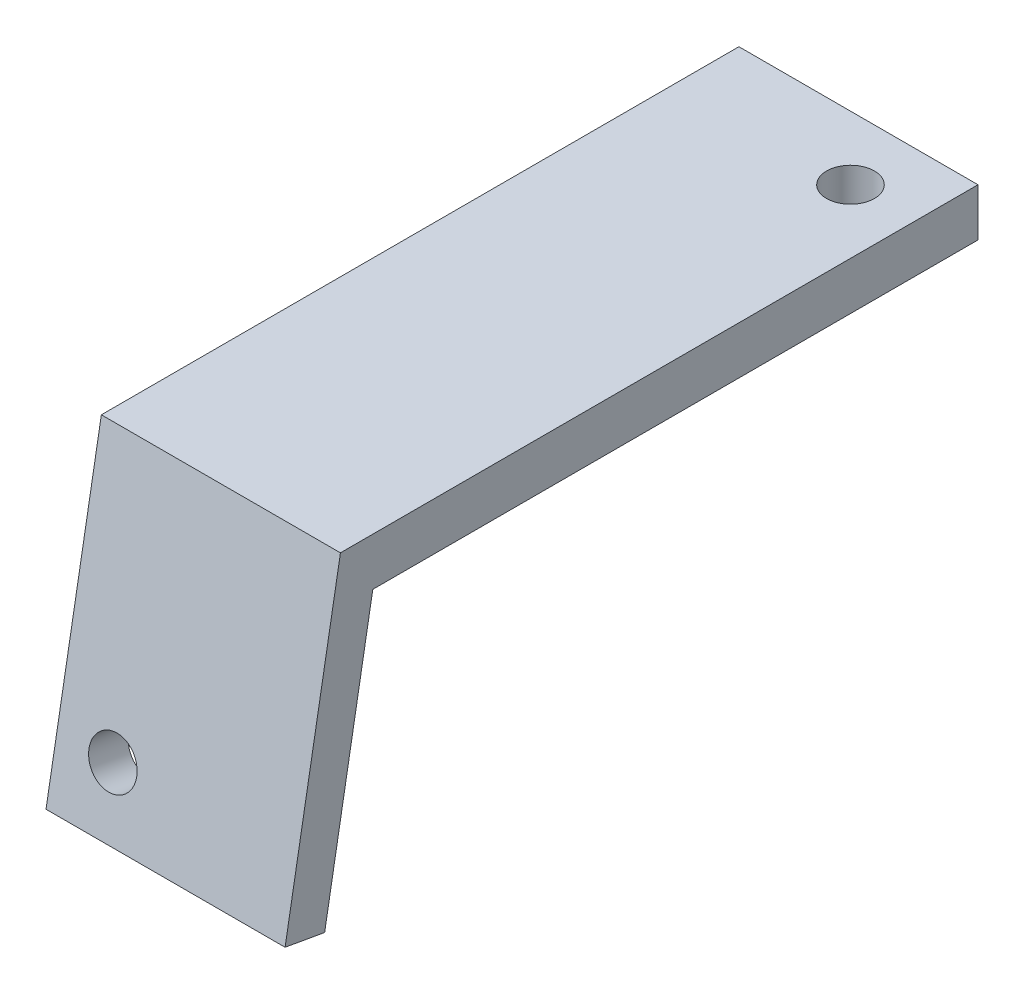
ISO-10303-21;
HEADER;
FILE_DESCRIPTION(('STEP AP214'),'2;1');
FILE_NAME('part.step','',(''),(''),'','','');
FILE_SCHEMA(('AUTOMOTIVE_DESIGN { 1 0 10303 214 1 1 1 1 }'));
ENDSEC;
DATA;
#1=APPLICATION_CONTEXT('core data for automotive mechanical design processes');
#2=APPLICATION_PROTOCOL_DEFINITION('international standard','automotive_design',2000,#1);
#3=PRODUCT_CONTEXT('',#1,'mechanical');
#4=PRODUCT('Part','Part','',(#3));
#5=PRODUCT_RELATED_PRODUCT_CATEGORY('part','',(#4));
#6=PRODUCT_DEFINITION_FORMATION('','',#4);
#7=PRODUCT_DEFINITION_CONTEXT('part definition',#1,'design');
#8=PRODUCT_DEFINITION('design','',#6,#7);
#9=PRODUCT_DEFINITION_SHAPE('','',#8);
#10=(LENGTH_UNIT() NAMED_UNIT(*) SI_UNIT(.MILLI.,.METRE.));
#11=(NAMED_UNIT(*) PLANE_ANGLE_UNIT() SI_UNIT($,.RADIAN.));
#12=(NAMED_UNIT(*) SI_UNIT($,.STERADIAN.) SOLID_ANGLE_UNIT());
#13=UNCERTAINTY_MEASURE_WITH_UNIT(LENGTH_MEASURE(1.E-05),#10,'distance_accuracy_value','');
#14=(GEOMETRIC_REPRESENTATION_CONTEXT(3) GLOBAL_UNCERTAINTY_ASSIGNED_CONTEXT((#13)) GLOBAL_UNIT_ASSIGNED_CONTEXT((#10,
#11,#12)) REPRESENTATION_CONTEXT('',''));
#15=CARTESIAN_POINT('',(0.,0.,0.));
#16=DIRECTION('',(0.,0.,1.));
#17=DIRECTION('',(1.,0.,0.));
#18=AXIS2_PLACEMENT_3D('',#15,#16,#17);
#19=CARTESIAN_POINT('',(0.,3.,0.));
#20=DIRECTION('',(0.,-1.,0.));
#21=DIRECTION('',(0.,0.,-1.));
#22=AXIS2_PLACEMENT_3D('',#19,#20,#21);
#23=PLANE('',#22);
#24=DIRECTION('',(0.,0.,-1.));
#25=VECTOR('',#24,1.);
#26=CARTESIAN_POINT('',(7.5,3.,20.));
#27=LINE('',#26,#25);
#28=CARTESIAN_POINT('',(7.5,3.,20.));
#29=VERTEX_POINT('',#28);
#30=CARTESIAN_POINT('',(7.5,3.,-20.));
#31=VERTEX_POINT('',#30);
#32=EDGE_CURVE('E97',#29,#31,#27,.T.);
#33=ORIENTED_EDGE('',*,*,#32,.T.);
#34=DIRECTION('',(-1.,0.,0.));
#35=VECTOR('',#34,1.);
#36=CARTESIAN_POINT('',(-7.5,3.,-20.));
#37=LINE('',#36,#35);
#38=CARTESIAN_POINT('',(-7.5,3.,-20.));
#39=VERTEX_POINT('',#38);
#40=EDGE_CURVE('E89',#31,#39,#37,.T.);
#41=ORIENTED_EDGE('',*,*,#40,.T.);
#42=DIRECTION('',(0.,0.,1.));
#43=VECTOR('',#42,1.);
#44=CARTESIAN_POINT('',(-7.5,3.,20.));
#45=LINE('',#44,#43);
#46=CARTESIAN_POINT('',(-7.5,3.,20.));
#47=VERTEX_POINT('',#46);
#48=EDGE_CURVE('E96',#39,#47,#45,.T.);
#49=ORIENTED_EDGE('',*,*,#48,.T.);
#50=DIRECTION('',(1.,0.,0.));
#51=VECTOR('',#50,1.);
#52=CARTESIAN_POINT('',(-7.5,3.,20.));
#53=LINE('',#52,#51);
#54=EDGE_CURVE('E101',#47,#29,#53,.T.);
#55=ORIENTED_EDGE('',*,*,#54,.T.);
#56=EDGE_LOOP('',(#33,#41,#49,#55));
#57=FACE_BOUND('',#56,.T.);
#58=CARTESIAN_POINT('',(3.5,3.,-16.));
#59=DIRECTION('',(0.,1.,0.));
#60=DIRECTION('',(0.,0.,1.));
#61=AXIS2_PLACEMENT_3D('',#58,#59,#60);
#62=CIRCLE('',#61,1.5);
#63=CARTESIAN_POINT('',(3.5,3.,-14.5));
#64=VERTEX_POINT('',#63);
#65=EDGE_CURVE('E141',#64,#64,#62,.T.);
#66=ORIENTED_EDGE('',*,*,#65,.F.);
#67=EDGE_LOOP('',(#66));
#68=FACE_BOUND('',#67,.T.);
#69=ADVANCED_FACE('F41',(#57,#68),#23,.F.);
#70=CARTESIAN_POINT('',(0.,0.,0.));
#71=DIRECTION('',(0.,-1.,0.));
#72=DIRECTION('',(0.,0.,-1.));
#73=AXIS2_PLACEMENT_3D('',#70,#71,#72);
#74=PLANE('',#73);
#75=DIRECTION('',(1.,0.,0.));
#76=VECTOR('',#75,1.);
#77=CARTESIAN_POINT('',(0.,0.,17.9691467762285));
#78=LINE('',#77,#76);
#79=CARTESIAN_POINT('',(-7.5,0.,17.9691467762285));
#80=VERTEX_POINT('',#79);
#81=CARTESIAN_POINT('',(7.5,0.,17.9691467762285));
#82=VERTEX_POINT('',#81);
#83=EDGE_CURVE('E147',#80,#82,#78,.T.);
#84=ORIENTED_EDGE('',*,*,#83,.F.);
#85=DIRECTION('',(0.,0.,1.));
#86=VECTOR('',#85,1.);
#87=CARTESIAN_POINT('',(-7.5,0.,20.));
#88=LINE('',#87,#86);
#89=CARTESIAN_POINT('',(-7.5,0.,-20.));
#90=VERTEX_POINT('',#89);
#91=EDGE_CURVE('E102',#90,#80,#88,.T.);
#92=ORIENTED_EDGE('',*,*,#91,.F.);
#93=DIRECTION('',(-1.,0.,0.));
#94=VECTOR('',#93,1.);
#95=CARTESIAN_POINT('',(-7.5,0.,-20.));
#96=LINE('',#95,#94);
#97=CARTESIAN_POINT('',(7.5,0.,-20.));
#98=VERTEX_POINT('',#97);
#99=EDGE_CURVE('E135',#98,#90,#96,.T.);
#100=ORIENTED_EDGE('',*,*,#99,.F.);
#101=DIRECTION('',(0.,0.,-1.));
#102=VECTOR('',#101,1.);
#103=CARTESIAN_POINT('',(7.5,0.,20.));
#104=LINE('',#103,#102);
#105=EDGE_CURVE('E71',#82,#98,#104,.T.);
#106=ORIENTED_EDGE('',*,*,#105,.F.);
#107=EDGE_LOOP('',(#84,#92,#100,#106));
#108=FACE_BOUND('',#107,.T.);
#109=CARTESIAN_POINT('',(3.5,0.,-16.));
#110=DIRECTION('',(0.,1.,0.));
#111=DIRECTION('',(0.,0.,1.));
#112=AXIS2_PLACEMENT_3D('',#109,#110,#111);
#113=CIRCLE('',#112,1.5);
#114=CARTESIAN_POINT('',(3.5,0.,-14.5));
#115=VERTEX_POINT('',#114);
#116=EDGE_CURVE('E143',#115,#115,#113,.T.);
#117=ORIENTED_EDGE('',*,*,#116,.T.);
#118=EDGE_LOOP('',(#117));
#119=FACE_BOUND('',#118,.T.);
#120=ADVANCED_FACE('F108',(#108,#119),#74,.T.);
#121=CARTESIAN_POINT('',(7.5,3.,20.));
#122=DIRECTION('',(-1.,0.,0.));
#123=DIRECTION('',(0.,0.,1.));
#124=AXIS2_PLACEMENT_3D('',#121,#122,#123);
#125=PLANE('',#124);
#126=DIRECTION('',(0.,0.984807753012207,-0.173648177666934));
#127=VECTOR('',#126,1.);
#128=CARTESIAN_POINT('',(7.5,-17.1339124843992,20.9903178323258));
#129=LINE('',#128,#127);
#130=CARTESIAN_POINT('',(7.5,-17.1339124843992,20.9903178323258));
#131=VERTEX_POINT('',#130);
#132=EDGE_CURVE('E106',#131,#82,#129,.T.);
#133=ORIENTED_EDGE('',*,*,#132,.T.);
#134=ORIENTED_EDGE('',*,*,#105,.T.);
#135=DIRECTION('',(0.,-1.,0.));
#136=VECTOR('',#135,1.);
#137=CARTESIAN_POINT('',(7.5,3.,-20.));
#138=LINE('',#137,#136);
#139=EDGE_CURVE('E11',#31,#98,#138,.T.);
#140=ORIENTED_EDGE('',*,*,#139,.F.);
#141=ORIENTED_EDGE('',*,*,#32,.F.);
#142=DIRECTION('',(0.,0.984807753012207,-0.173648177666934));
#143=VECTOR('',#142,1.);
#144=CARTESIAN_POINT('',(7.5,-16.6961550602442,23.4729635533387));
#145=LINE('',#144,#143);
#146=CARTESIAN_POINT('',(7.5,-16.6961550602442,23.4729635533387));
#147=VERTEX_POINT('',#146);
#148=EDGE_CURVE('E58',#147,#29,#145,.T.);
#149=ORIENTED_EDGE('',*,*,#148,.F.);
#150=DIRECTION('',(0.,-0.173648177666934,-0.984807753012207));
#151=VECTOR('',#150,1.);
#152=CARTESIAN_POINT('',(7.5,-17.1339124843992,20.9903178323258));
#153=LINE('',#152,#151);
#154=EDGE_CURVE('E159',#147,#131,#153,.T.);
#155=ORIENTED_EDGE('',*,*,#154,.T.);
#156=EDGE_LOOP('',(#133,#134,#140,#141,#149,#155));
#157=FACE_BOUND('',#156,.T.);
#158=ADVANCED_FACE('F43',(#157),#125,.F.);
#159=CARTESIAN_POINT('',(-7.5,3.,-20.));
#160=DIRECTION('',(0.,0.,1.));
#161=DIRECTION('',(1.,0.,0.));
#162=AXIS2_PLACEMENT_3D('',#159,#160,#161);
#163=PLANE('',#162);
#164=ORIENTED_EDGE('',*,*,#99,.T.);
#165=DIRECTION('',(0.,-1.,0.));
#166=VECTOR('',#165,1.);
#167=CARTESIAN_POINT('',(-7.5,3.,-20.));
#168=LINE('',#167,#166);
#169=EDGE_CURVE('E50',#39,#90,#168,.T.);
#170=ORIENTED_EDGE('',*,*,#169,.F.);
#171=ORIENTED_EDGE('',*,*,#40,.F.);
#172=ORIENTED_EDGE('',*,*,#139,.T.);
#173=EDGE_LOOP('',(#164,#170,#171,#172));
#174=FACE_BOUND('',#173,.T.);
#175=ADVANCED_FACE('F91',(#174),#163,.F.);
#176=CARTESIAN_POINT('',(-7.5,3.,20.));
#177=DIRECTION('',(1.,0.,0.));
#178=DIRECTION('',(0.,0.,-1.));
#179=AXIS2_PLACEMENT_3D('',#176,#177,#178);
#180=PLANE('',#179);
#181=ORIENTED_EDGE('',*,*,#91,.T.);
#182=DIRECTION('',(0.,0.984807753012207,-0.173648177666934));
#183=VECTOR('',#182,1.);
#184=CARTESIAN_POINT('',(-7.5,-17.1339124843992,20.9903178323258));
#185=LINE('',#184,#183);
#186=CARTESIAN_POINT('',(-7.5,-17.1339124843992,20.9903178323258));
#187=VERTEX_POINT('',#186);
#188=EDGE_CURVE('E81',#187,#80,#185,.T.);
#189=ORIENTED_EDGE('',*,*,#188,.F.);
#190=DIRECTION('',(0.,0.173648177666934,0.984807753012207));
#191=VECTOR('',#190,1.);
#192=CARTESIAN_POINT('',(-7.5,-17.1339124843992,20.9903178323258));
#193=LINE('',#192,#191);
#194=CARTESIAN_POINT('',(-7.5,-16.6961550602442,23.4729635533387));
#195=VERTEX_POINT('',#194);
#196=EDGE_CURVE('E163',#187,#195,#193,.T.);
#197=ORIENTED_EDGE('',*,*,#196,.T.);
#198=DIRECTION('',(0.,0.984807753012207,-0.173648177666934));
#199=VECTOR('',#198,1.);
#200=CARTESIAN_POINT('',(-7.5,-16.6961550602442,23.4729635533387));
#201=LINE('',#200,#199);
#202=EDGE_CURVE('E151',#195,#47,#201,.T.);
#203=ORIENTED_EDGE('',*,*,#202,.T.);
#204=ORIENTED_EDGE('',*,*,#48,.F.);
#205=ORIENTED_EDGE('',*,*,#169,.T.);
#206=EDGE_LOOP('',(#181,#189,#197,#203,#204,#205));
#207=FACE_BOUND('',#206,.T.);
#208=ADVANCED_FACE('F113',(#207),#180,.F.);
#209=CARTESIAN_POINT('',(3.5,3.,-16.));
#210=DIRECTION('',(0.,-1.,0.));
#211=DIRECTION('',(0.,0.,-1.));
#212=AXIS2_PLACEMENT_3D('',#209,#210,#211);
#213=CYLINDRICAL_SURFACE('',#212,1.5);
#214=ORIENTED_EDGE('',*,*,#65,.T.);
#215=EDGE_LOOP('',(#214));
#216=FACE_BOUND('',#215,.T.);
#217=ORIENTED_EDGE('',*,*,#116,.F.);
#218=EDGE_LOOP('',(#217));
#219=FACE_BOUND('',#218,.T.);
#220=ADVANCED_FACE('F121',(#216,#219),#213,.F.);
#221=CARTESIAN_POINT('',(-7.5,-17.1339124843992,20.9903178323258));
#222=DIRECTION('',(0.,-0.173648177666934,-0.984807753012207));
#223=DIRECTION('',(0.,0.984807753012207,-0.173648177666934));
#224=AXIS2_PLACEMENT_3D('',#221,#222,#223);
#225=PLANE('',#224);
#226=CARTESIAN_POINT('',(-4.,-13.1946814723503,20.295725121658));
#227=DIRECTION('',(0.,-0.173648177666934,-0.984807753012207));
#228=DIRECTION('',(0.,0.984807753012207,-0.173648177666934));
#229=AXIS2_PLACEMENT_3D('',#226,#227,#228);
#230=CIRCLE('',#229,1.5);
#231=CARTESIAN_POINT('',(-4.,-11.717469842832,20.0352528551576));
#232=VERTEX_POINT('',#231);
#233=EDGE_CURVE('E165',#232,#232,#230,.T.);
#234=ORIENTED_EDGE('',*,*,#233,.F.);
#235=EDGE_LOOP('',(#234));
#236=FACE_BOUND('',#235,.T.);
#237=ORIENTED_EDGE('',*,*,#188,.T.);
#238=ORIENTED_EDGE('',*,*,#83,.T.);
#239=ORIENTED_EDGE('',*,*,#132,.F.);
#240=DIRECTION('',(-1.,0.,0.));
#241=VECTOR('',#240,1.);
#242=CARTESIAN_POINT('',(-7.5,-17.1339124843992,20.9903178323258));
#243=LINE('',#242,#241);
#244=EDGE_CURVE('E154',#131,#187,#243,.T.);
#245=ORIENTED_EDGE('',*,*,#244,.T.);
#246=EDGE_LOOP('',(#237,#238,#239,#245));
#247=FACE_BOUND('',#246,.T.);
#248=ADVANCED_FACE('F129',(#236,#247),#225,.T.);
#249=CARTESIAN_POINT('',(-7.5,-16.6961550602442,23.4729635533387));
#250=DIRECTION('',(0.,0.173648177666934,0.984807753012207));
#251=DIRECTION('',(0.,-0.984807753012207,0.173648177666934));
#252=AXIS2_PLACEMENT_3D('',#249,#250,#251);
#253=PLANE('',#252);
#254=CARTESIAN_POINT('',(-4.,-12.7569240481953,22.778370842671));
#255=DIRECTION('',(0.,0.173648177666934,0.984807753012207));
#256=DIRECTION('',(0.,-0.984807753012207,0.173648177666934));
#257=AXIS2_PLACEMENT_3D('',#254,#255,#256);
#258=CIRCLE('',#257,1.5);
#259=CARTESIAN_POINT('',(-4.,-14.2341356777136,23.0388431091714));
#260=VERTEX_POINT('',#259);
#261=EDGE_CURVE('E168',#260,#260,#258,.T.);
#262=ORIENTED_EDGE('',*,*,#261,.F.);
#263=EDGE_LOOP('',(#262));
#264=FACE_BOUND('',#263,.T.);
#265=ORIENTED_EDGE('',*,*,#54,.F.);
#266=ORIENTED_EDGE('',*,*,#202,.F.);
#267=DIRECTION('',(1.,0.,0.));
#268=VECTOR('',#267,1.);
#269=CARTESIAN_POINT('',(-7.5,-16.6961550602442,23.4729635533387));
#270=LINE('',#269,#268);
#271=EDGE_CURVE('E161',#195,#147,#270,.T.);
#272=ORIENTED_EDGE('',*,*,#271,.T.);
#273=ORIENTED_EDGE('',*,*,#148,.T.);
#274=EDGE_LOOP('',(#265,#266,#272,#273));
#275=FACE_BOUND('',#274,.T.);
#276=ADVANCED_FACE('F174',(#264,#275),#253,.T.);
#277=CARTESIAN_POINT('',(0.,-20.206817562322,3.56300713049111));
#278=DIRECTION('',(0.,0.984807753012208,-0.173648177666934));
#279=DIRECTION('',(0.,0.173648177666934,0.984807753012208));
#280=AXIS2_PLACEMENT_3D('',#277,#278,#279);
#281=PLANE('',#280);
#282=ORIENTED_EDGE('',*,*,#196,.F.);
#283=ORIENTED_EDGE('',*,*,#244,.F.);
#284=ORIENTED_EDGE('',*,*,#154,.F.);
#285=ORIENTED_EDGE('',*,*,#271,.F.);
#286=EDGE_LOOP('',(#282,#283,#284,#285));
#287=FACE_BOUND('',#286,.T.);
#288=ADVANCED_FACE('F176',(#287),#281,.F.);
#289=CARTESIAN_POINT('',(-4.,-14.4934058248647,12.9302933125489));
#290=DIRECTION('',(0.,0.173648177666934,0.984807753012207));
#291=DIRECTION('',(0.,-0.984807753012207,0.173648177666934));
#292=AXIS2_PLACEMENT_3D('',#289,#290,#291);
#293=CYLINDRICAL_SURFACE('',#292,1.5);
#294=ORIENTED_EDGE('',*,*,#233,.T.);
#295=EDGE_LOOP('',(#294));
#296=FACE_BOUND('',#295,.T.);
#297=ORIENTED_EDGE('',*,*,#261,.T.);
#298=EDGE_LOOP('',(#297));
#299=FACE_BOUND('',#298,.T.);
#300=ADVANCED_FACE('F172',(#296,#299),#293,.F.);
#301=CLOSED_SHELL('',(#69,#120,#158,#175,#208,#220,#248,#276,#288,#300));
#302=MANIFOLD_SOLID_BREP('B2',#301);
#303=ADVANCED_BREP_SHAPE_REPRESENTATION('',(#18,#302),#14);
#304=SHAPE_DEFINITION_REPRESENTATION(#9,#303);
ENDSEC;
END-ISO-10303-21;
